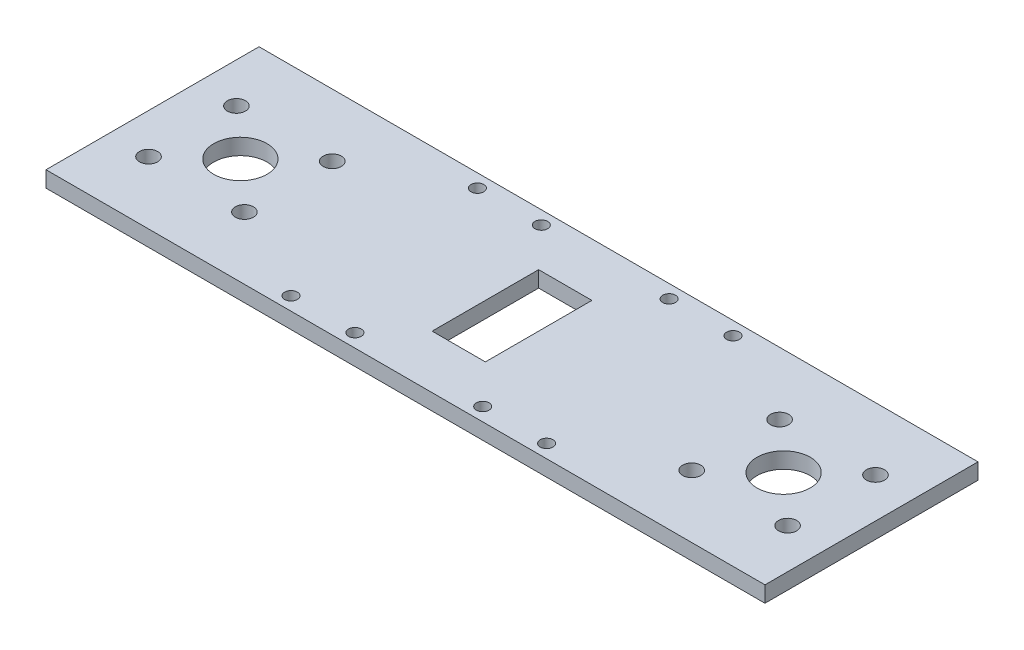
ISO-10303-21;
HEADER;
FILE_DESCRIPTION(('STEP AP214'),'2;1');
FILE_NAME('part.step','',(''),(''),'','','');
FILE_SCHEMA(('AUTOMOTIVE_DESIGN { 1 0 10303 214 1 1 1 1 }'));
ENDSEC;
DATA;
#1=APPLICATION_CONTEXT('core data for automotive mechanical design processes');
#2=APPLICATION_PROTOCOL_DEFINITION('international standard','automotive_design',2000,#1);
#3=PRODUCT_CONTEXT('',#1,'mechanical');
#4=PRODUCT('Part','Part','',(#3));
#5=PRODUCT_RELATED_PRODUCT_CATEGORY('part','',(#4));
#6=PRODUCT_DEFINITION_FORMATION('','',#4);
#7=PRODUCT_DEFINITION_CONTEXT('part definition',#1,'design');
#8=PRODUCT_DEFINITION('design','',#6,#7);
#9=PRODUCT_DEFINITION_SHAPE('','',#8);
#10=(LENGTH_UNIT() NAMED_UNIT(*) SI_UNIT(.MILLI.,.METRE.));
#11=(NAMED_UNIT(*) PLANE_ANGLE_UNIT() SI_UNIT($,.RADIAN.));
#12=(NAMED_UNIT(*) SI_UNIT($,.STERADIAN.) SOLID_ANGLE_UNIT());
#13=UNCERTAINTY_MEASURE_WITH_UNIT(LENGTH_MEASURE(1.E-05),#10,'distance_accuracy_value','');
#14=(GEOMETRIC_REPRESENTATION_CONTEXT(3) GLOBAL_UNCERTAINTY_ASSIGNED_CONTEXT((#13)) GLOBAL_UNIT_ASSIGNED_CONTEXT((#10,
#11,#12)) REPRESENTATION_CONTEXT('',''));
#15=CARTESIAN_POINT('',(0.,0.,0.));
#16=DIRECTION('',(0.,0.,1.));
#17=DIRECTION('',(1.,0.,0.));
#18=AXIS2_PLACEMENT_3D('',#15,#16,#17);
#19=CARTESIAN_POINT('',(0.,3.,0.));
#20=DIRECTION('',(0.,1.,0.));
#21=DIRECTION('',(0.,0.,1.));
#22=AXIS2_PLACEMENT_3D('',#19,#20,#21);
#23=PLANE('',#22);
#24=CARTESIAN_POINT('',(24.,3.,-17.5000000000001));
#25=DIRECTION('',(0.,1.,0.));
#26=DIRECTION('',(0.,0.,-1.));
#27=AXIS2_PLACEMENT_3D('',#24,#25,#26);
#28=CIRCLE('',#27,1.2);
#29=CARTESIAN_POINT('',(24.,3.,-18.7000000000001));
#30=VERTEX_POINT('',#29);
#31=EDGE_CURVE('E481',#30,#30,#28,.T.);
#32=ORIENTED_EDGE('',*,*,#31,.F.);
#33=EDGE_LOOP('',(#32));
#34=FACE_BOUND('',#33,.T.);
#35=CARTESIAN_POINT('',(12.,3.,17.5));
#36=DIRECTION('',(0.,1.,0.));
#37=DIRECTION('',(0.,0.,1.));
#38=AXIS2_PLACEMENT_3D('',#35,#36,#37);
#39=CIRCLE('',#38,1.2);
#40=CARTESIAN_POINT('',(12.,3.,18.7));
#41=VERTEX_POINT('',#40);
#42=EDGE_CURVE('E477',#41,#41,#39,.T.);
#43=ORIENTED_EDGE('',*,*,#42,.F.);
#44=EDGE_LOOP('',(#43));
#45=FACE_BOUND('',#44,.T.);
#46=CARTESIAN_POINT('',(12.,3.,-17.5));
#47=DIRECTION('',(0.,1.,0.));
#48=DIRECTION('',(0.,0.,-1.));
#49=AXIS2_PLACEMENT_3D('',#46,#47,#48);
#50=CIRCLE('',#49,1.2);
#51=CARTESIAN_POINT('',(12.,3.,-18.7));
#52=VERTEX_POINT('',#51);
#53=EDGE_CURVE('E482',#52,#52,#50,.T.);
#54=ORIENTED_EDGE('',*,*,#53,.F.);
#55=EDGE_LOOP('',(#54));
#56=FACE_BOUND('',#55,.T.);
#57=CARTESIAN_POINT('',(-24.,3.,17.4999999999999));
#58=DIRECTION('',(0.,1.,0.));
#59=DIRECTION('',(0.,0.,-1.));
#60=AXIS2_PLACEMENT_3D('',#57,#58,#59);
#61=CIRCLE('',#60,1.2);
#62=CARTESIAN_POINT('',(-24.,3.,16.2999999999999));
#63=VERTEX_POINT('',#62);
#64=EDGE_CURVE('E485',#63,#63,#61,.T.);
#65=ORIENTED_EDGE('',*,*,#64,.F.);
#66=EDGE_LOOP('',(#65));
#67=FACE_BOUND('',#66,.T.);
#68=CARTESIAN_POINT('',(-24.,3.,-17.5000000000001));
#69=DIRECTION('',(0.,1.,0.));
#70=DIRECTION('',(0.,0.,1.));
#71=AXIS2_PLACEMENT_3D('',#68,#69,#70);
#72=CIRCLE('',#71,1.2);
#73=CARTESIAN_POINT('',(-24.,3.,-16.3000000000001));
#74=VERTEX_POINT('',#73);
#75=EDGE_CURVE('E492',#74,#74,#72,.T.);
#76=ORIENTED_EDGE('',*,*,#75,.F.);
#77=EDGE_LOOP('',(#76));
#78=FACE_BOUND('',#77,.T.);
#79=CARTESIAN_POINT('',(-12.,3.,17.5));
#80=DIRECTION('',(0.,1.,0.));
#81=DIRECTION('',(0.,0.,-1.));
#82=AXIS2_PLACEMENT_3D('',#79,#80,#81);
#83=CIRCLE('',#82,1.2);
#84=CARTESIAN_POINT('',(-12.,3.,16.3));
#85=VERTEX_POINT('',#84);
#86=EDGE_CURVE('E474',#85,#85,#83,.T.);
#87=ORIENTED_EDGE('',*,*,#86,.F.);
#88=EDGE_LOOP('',(#87));
#89=FACE_BOUND('',#88,.T.);
#90=CARTESIAN_POINT('',(-12.,3.,-17.5));
#91=DIRECTION('',(0.,1.,0.));
#92=DIRECTION('',(0.,0.,1.));
#93=AXIS2_PLACEMENT_3D('',#90,#91,#92);
#94=CIRCLE('',#93,1.2);
#95=CARTESIAN_POINT('',(-12.,3.,-16.3));
#96=VERTEX_POINT('',#95);
#97=EDGE_CURVE('E471',#96,#96,#94,.T.);
#98=ORIENTED_EDGE('',*,*,#97,.F.);
#99=EDGE_LOOP('',(#98));
#100=FACE_BOUND('',#99,.T.);
#101=CARTESIAN_POINT('',(24.,3.,17.4999999999999));
#102=DIRECTION('',(0.,1.,0.));
#103=DIRECTION('',(0.,0.,1.));
#104=AXIS2_PLACEMENT_3D('',#101,#102,#103);
#105=CIRCLE('',#104,1.2);
#106=CARTESIAN_POINT('',(24.,3.,18.6999999999999));
#107=VERTEX_POINT('',#106);
#108=EDGE_CURVE('E283',#107,#107,#105,.T.);
#109=ORIENTED_EDGE('',*,*,#108,.F.);
#110=EDGE_LOOP('',(#109));
#111=FACE_BOUND('',#110,.T.);
#112=CARTESIAN_POINT('',(59.9999999999999,3.,8.25000000000005));
#113=DIRECTION('',(0.,1.,0.));
#114=DIRECTION('',(0.,0.,-1.));
#115=AXIS2_PLACEMENT_3D('',#112,#113,#114);
#116=CIRCLE('',#115,1.70000000000108);
#117=CARTESIAN_POINT('',(59.9999999999999,3.,6.54999999999897));
#118=VERTEX_POINT('',#117);
#119=EDGE_CURVE('E170',#118,#118,#116,.T.);
#120=ORIENTED_EDGE('',*,*,#119,.F.);
#121=EDGE_LOOP('',(#120));
#122=FACE_BOUND('',#121,.T.);
#123=CARTESIAN_POINT('',(42.0000000000001,3.,-8.24999999999994));
#124=DIRECTION('',(0.,1.,0.));
#125=DIRECTION('',(0.,0.,-1.));
#126=AXIS2_PLACEMENT_3D('',#123,#124,#125);
#127=CIRCLE('',#126,1.70000000000108);
#128=CARTESIAN_POINT('',(42.0000000000001,3.,-9.95000000000103));
#129=VERTEX_POINT('',#128);
#130=EDGE_CURVE('E186',#129,#129,#127,.T.);
#131=ORIENTED_EDGE('',*,*,#130,.F.);
#132=EDGE_LOOP('',(#131));
#133=FACE_BOUND('',#132,.T.);
#134=CARTESIAN_POINT('',(-41.9999999999999,3.,8.25000000000007));
#135=DIRECTION('',(0.,1.,0.));
#136=DIRECTION('',(0.,0.,1.));
#137=AXIS2_PLACEMENT_3D('',#134,#135,#136);
#138=CIRCLE('',#137,1.70000000000108);
#139=CARTESIAN_POINT('',(-41.9999999999999,3.,9.95000000000115));
#140=VERTEX_POINT('',#139);
#141=EDGE_CURVE('E202',#140,#140,#138,.T.);
#142=ORIENTED_EDGE('',*,*,#141,.F.);
#143=EDGE_LOOP('',(#142));
#144=FACE_BOUND('',#143,.T.);
#145=CARTESIAN_POINT('',(51.0000000000001,3.,0.));
#146=DIRECTION('',(0.,1.,0.));
#147=DIRECTION('',(0.,0.,-1.));
#148=AXIS2_PLACEMENT_3D('',#145,#146,#147);
#149=CIRCLE('',#148,5.);
#150=CARTESIAN_POINT('',(51.0000000000001,3.,-4.99999999999994));
#151=VERTEX_POINT('',#150);
#152=EDGE_CURVE('E218',#151,#151,#149,.T.);
#153=ORIENTED_EDGE('',*,*,#152,.F.);
#154=EDGE_LOOP('',(#153));
#155=FACE_BOUND('',#154,.T.);
#156=CARTESIAN_POINT('',(-51.0000000000001,3.,0.));
#157=DIRECTION('',(0.,1.,0.));
#158=DIRECTION('',(0.,0.,1.));
#159=AXIS2_PLACEMENT_3D('',#156,#157,#158);
#160=CIRCLE('',#159,5.);
#161=CARTESIAN_POINT('',(-51.0000000000001,3.,5.00000000000006));
#162=VERTEX_POINT('',#161);
#163=EDGE_CURVE('E234',#162,#162,#160,.T.);
#164=ORIENTED_EDGE('',*,*,#163,.F.);
#165=EDGE_LOOP('',(#164));
#166=FACE_BOUND('',#165,.T.);
#167=DIRECTION('',(0.,0.,-1.));
#168=VECTOR('',#167,1.);
#169=CARTESIAN_POINT('',(67.4999999999999,3.,-19.9999999999999));
#170=LINE('',#169,#168);
#171=CARTESIAN_POINT('',(67.4999999999999,3.,20.0000000000001));
#172=VERTEX_POINT('',#171);
#173=CARTESIAN_POINT('',(67.4999999999999,3.,-19.9999999999999));
#174=VERTEX_POINT('',#173);
#175=EDGE_CURVE('E242',#172,#174,#170,.T.);
#176=ORIENTED_EDGE('',*,*,#175,.T.);
#177=DIRECTION('',(-1.,0.,0.));
#178=VECTOR('',#177,1.);
#179=CARTESIAN_POINT('',(-67.5000000000001,3.,-19.9999999999999));
#180=LINE('',#179,#178);
#181=CARTESIAN_POINT('',(-67.5000000000001,3.,-19.9999999999999));
#182=VERTEX_POINT('',#181);
#183=EDGE_CURVE('E246',#174,#182,#180,.T.);
#184=ORIENTED_EDGE('',*,*,#183,.T.);
#185=DIRECTION('',(0.,0.,1.));
#186=VECTOR('',#185,1.);
#187=CARTESIAN_POINT('',(-67.5000000000001,3.,-19.9999999999999));
#188=LINE('',#187,#186);
#189=CARTESIAN_POINT('',(-67.5000000000001,3.,20.));
#190=VERTEX_POINT('',#189);
#191=EDGE_CURVE('E250',#182,#190,#188,.T.);
#192=ORIENTED_EDGE('',*,*,#191,.T.);
#193=DIRECTION('',(1.,0.,0.));
#194=VECTOR('',#193,1.);
#195=CARTESIAN_POINT('',(-67.5000000000001,3.,20.));
#196=LINE('',#195,#194);
#197=EDGE_CURVE('E253',#190,#172,#196,.T.);
#198=ORIENTED_EDGE('',*,*,#197,.T.);
#199=EDGE_LOOP('',(#176,#184,#192,#198));
#200=FACE_BOUND('',#199,.T.);
#201=CARTESIAN_POINT('',(-60.0000000000001,3.,-8.24999999999993));
#202=DIRECTION('',(0.,1.,0.));
#203=DIRECTION('',(0.,0.,1.));
#204=AXIS2_PLACEMENT_3D('',#201,#202,#203);
#205=CIRCLE('',#204,1.70000000000108);
#206=CARTESIAN_POINT('',(-60.0000000000001,3.,-6.54999999999885));
#207=VERTEX_POINT('',#206);
#208=EDGE_CURVE('E226',#207,#207,#205,.T.);
#209=ORIENTED_EDGE('',*,*,#208,.F.);
#210=EDGE_LOOP('',(#209));
#211=FACE_BOUND('',#210,.T.);
#212=CARTESIAN_POINT('',(-42.0000000000001,3.,-8.24999999999993));
#213=DIRECTION('',(0.,1.,0.));
#214=DIRECTION('',(0.,0.,1.));
#215=AXIS2_PLACEMENT_3D('',#212,#213,#214);
#216=CIRCLE('',#215,1.70000000000108);
#217=CARTESIAN_POINT('',(-42.0000000000001,3.,-6.54999999999885));
#218=VERTEX_POINT('',#217);
#219=EDGE_CURVE('E210',#218,#218,#216,.T.);
#220=ORIENTED_EDGE('',*,*,#219,.F.);
#221=EDGE_LOOP('',(#220));
#222=FACE_BOUND('',#221,.T.);
#223=CARTESIAN_POINT('',(-59.9999999999999,3.,8.25000000000006));
#224=DIRECTION('',(0.,1.,0.));
#225=DIRECTION('',(0.,0.,1.));
#226=AXIS2_PLACEMENT_3D('',#223,#224,#225);
#227=CIRCLE('',#226,1.70000000000108);
#228=CARTESIAN_POINT('',(-59.9999999999999,3.,9.95000000000115));
#229=VERTEX_POINT('',#228);
#230=EDGE_CURVE('E194',#229,#229,#227,.T.);
#231=ORIENTED_EDGE('',*,*,#230,.F.);
#232=EDGE_LOOP('',(#231));
#233=FACE_BOUND('',#232,.T.);
#234=CARTESIAN_POINT('',(41.9999999999999,3.,8.25000000000006));
#235=DIRECTION('',(0.,1.,0.));
#236=DIRECTION('',(0.,0.,-1.));
#237=AXIS2_PLACEMENT_3D('',#234,#235,#236);
#238=CIRCLE('',#237,1.70000000000108);
#239=CARTESIAN_POINT('',(41.9999999999999,3.,6.54999999999897));
#240=VERTEX_POINT('',#239);
#241=EDGE_CURVE('E178',#240,#240,#238,.T.);
#242=ORIENTED_EDGE('',*,*,#241,.F.);
#243=EDGE_LOOP('',(#242));
#244=FACE_BOUND('',#243,.T.);
#245=CARTESIAN_POINT('',(60.0000000000001,3.,-8.24999999999995));
#246=DIRECTION('',(0.,1.,0.));
#247=DIRECTION('',(0.,0.,-1.));
#248=AXIS2_PLACEMENT_3D('',#245,#246,#247);
#249=CIRCLE('',#248,1.70000000000108);
#250=CARTESIAN_POINT('',(60.0000000000001,3.,-9.95000000000103));
#251=VERTEX_POINT('',#250);
#252=EDGE_CURVE('E162',#251,#251,#249,.T.);
#253=ORIENTED_EDGE('',*,*,#252,.F.);
#254=EDGE_LOOP('',(#253));
#255=FACE_BOUND('',#254,.T.);
#256=DIRECTION('',(-1.,0.,0.));
#257=VECTOR('',#256,1.);
#258=CARTESIAN_POINT('',(-5.00000000000005,3.,-9.99999999999997));
#259=LINE('',#258,#257);
#260=CARTESIAN_POINT('',(4.99999999999995,3.,-9.99999999999997));
#261=VERTEX_POINT('',#260);
#262=CARTESIAN_POINT('',(-5.00000000000005,3.,-9.99999999999997));
#263=VERTEX_POINT('',#262);
#264=EDGE_CURVE('E122',#261,#263,#259,.T.);
#265=ORIENTED_EDGE('',*,*,#264,.F.);
#266=DIRECTION('',(0.,0.,-1.));
#267=VECTOR('',#266,1.);
#268=CARTESIAN_POINT('',(4.99999999999995,3.,-9.99999999999997));
#269=LINE('',#268,#267);
#270=CARTESIAN_POINT('',(4.99999999999995,3.,10.));
#271=VERTEX_POINT('',#270);
#272=EDGE_CURVE('E113',#271,#261,#269,.T.);
#273=ORIENTED_EDGE('',*,*,#272,.F.);
#274=DIRECTION('',(1.,0.,0.));
#275=VECTOR('',#274,1.);
#276=CARTESIAN_POINT('',(-5.00000000000005,3.,10.));
#277=LINE('',#276,#275);
#278=CARTESIAN_POINT('',(-5.00000000000005,3.,10.));
#279=VERTEX_POINT('',#278);
#280=EDGE_CURVE('E139',#279,#271,#277,.T.);
#281=ORIENTED_EDGE('',*,*,#280,.F.);
#282=DIRECTION('',(0.,0.,1.));
#283=VECTOR('',#282,1.);
#284=CARTESIAN_POINT('',(-5.00000000000005,3.,-9.99999999999997));
#285=LINE('',#284,#283);
#286=EDGE_CURVE('E135',#263,#279,#285,.T.);
#287=ORIENTED_EDGE('',*,*,#286,.F.);
#288=EDGE_LOOP('',(#265,#273,#281,#287));
#289=FACE_BOUND('',#288,.T.);
#290=ADVANCED_FACE('F45',(#34,#45,#56,#67,#78,#89,#100,#111,#122,#133,#144,#155,#166,#200,#211,
#222,#233,#244,#255,#289),#23,.T.);
#291=CARTESIAN_POINT('',(0.,0.,0.));
#292=DIRECTION('',(0.,1.,0.));
#293=DIRECTION('',(0.,0.,1.));
#294=AXIS2_PLACEMENT_3D('',#291,#292,#293);
#295=PLANE('',#294);
#296=CARTESIAN_POINT('',(24.,0.,-17.5000000000001));
#297=DIRECTION('',(0.,1.,0.));
#298=DIRECTION('',(0.,0.,1.));
#299=AXIS2_PLACEMENT_3D('',#296,#297,#298);
#300=CIRCLE('',#299,1.2);
#301=CARTESIAN_POINT('',(24.,0.,-16.3000000000001));
#302=VERTEX_POINT('',#301);
#303=EDGE_CURVE('E49',#302,#302,#300,.T.);
#304=ORIENTED_EDGE('',*,*,#303,.T.);
#305=EDGE_LOOP('',(#304));
#306=FACE_BOUND('',#305,.T.);
#307=CARTESIAN_POINT('',(12.,0.,17.5));
#308=DIRECTION('',(0.,1.,0.));
#309=DIRECTION('',(0.,0.,1.));
#310=AXIS2_PLACEMENT_3D('',#307,#308,#309);
#311=CIRCLE('',#310,1.2);
#312=CARTESIAN_POINT('',(12.,0.,18.7));
#313=VERTEX_POINT('',#312);
#314=EDGE_CURVE('E302',#313,#313,#311,.T.);
#315=ORIENTED_EDGE('',*,*,#314,.T.);
#316=EDGE_LOOP('',(#315));
#317=FACE_BOUND('',#316,.T.);
#318=CARTESIAN_POINT('',(12.,0.,-17.5));
#319=DIRECTION('',(0.,1.,0.));
#320=DIRECTION('',(0.,0.,1.));
#321=AXIS2_PLACEMENT_3D('',#318,#319,#320);
#322=CIRCLE('',#321,1.2);
#323=CARTESIAN_POINT('',(12.,0.,-16.3));
#324=VERTEX_POINT('',#323);
#325=EDGE_CURVE('E299',#324,#324,#322,.T.);
#326=ORIENTED_EDGE('',*,*,#325,.T.);
#327=EDGE_LOOP('',(#326));
#328=FACE_BOUND('',#327,.T.);
#329=CARTESIAN_POINT('',(-24.,0.,17.4999999999999));
#330=DIRECTION('',(0.,1.,0.));
#331=DIRECTION('',(0.,0.,1.));
#332=AXIS2_PLACEMENT_3D('',#329,#330,#331);
#333=CIRCLE('',#332,1.2);
#334=CARTESIAN_POINT('',(-24.,0.,18.6999999999999));
#335=VERTEX_POINT('',#334);
#336=EDGE_CURVE('E295',#335,#335,#333,.T.);
#337=ORIENTED_EDGE('',*,*,#336,.T.);
#338=EDGE_LOOP('',(#337));
#339=FACE_BOUND('',#338,.T.);
#340=CARTESIAN_POINT('',(-24.,0.,-17.5000000000001));
#341=DIRECTION('',(0.,1.,0.));
#342=DIRECTION('',(0.,0.,1.));
#343=AXIS2_PLACEMENT_3D('',#340,#341,#342);
#344=CIRCLE('',#343,1.2);
#345=CARTESIAN_POINT('',(-24.,0.,-16.3000000000001));
#346=VERTEX_POINT('',#345);
#347=EDGE_CURVE('E291',#346,#346,#344,.T.);
#348=ORIENTED_EDGE('',*,*,#347,.T.);
#349=EDGE_LOOP('',(#348));
#350=FACE_BOUND('',#349,.T.);
#351=CARTESIAN_POINT('',(-12.,0.,17.5));
#352=DIRECTION('',(0.,1.,0.));
#353=DIRECTION('',(0.,0.,1.));
#354=AXIS2_PLACEMENT_3D('',#351,#352,#353);
#355=CIRCLE('',#354,1.2);
#356=CARTESIAN_POINT('',(-12.,0.,18.7));
#357=VERTEX_POINT('',#356);
#358=EDGE_CURVE('E287',#357,#357,#355,.T.);
#359=ORIENTED_EDGE('',*,*,#358,.T.);
#360=EDGE_LOOP('',(#359));
#361=FACE_BOUND('',#360,.T.);
#362=CARTESIAN_POINT('',(-12.,0.,-17.5));
#363=DIRECTION('',(0.,1.,0.));
#364=DIRECTION('',(0.,0.,1.));
#365=AXIS2_PLACEMENT_3D('',#362,#363,#364);
#366=CIRCLE('',#365,1.2);
#367=CARTESIAN_POINT('',(-12.,0.,-16.3));
#368=VERTEX_POINT('',#367);
#369=EDGE_CURVE('E282',#368,#368,#366,.T.);
#370=ORIENTED_EDGE('',*,*,#369,.T.);
#371=EDGE_LOOP('',(#370));
#372=FACE_BOUND('',#371,.T.);
#373=CARTESIAN_POINT('',(24.,0.,17.4999999999999));
#374=DIRECTION('',(0.,1.,0.));
#375=DIRECTION('',(0.,0.,1.));
#376=AXIS2_PLACEMENT_3D('',#373,#374,#375);
#377=CIRCLE('',#376,1.2);
#378=CARTESIAN_POINT('',(24.,0.,18.6999999999999));
#379=VERTEX_POINT('',#378);
#380=EDGE_CURVE('E278',#379,#379,#377,.T.);
#381=ORIENTED_EDGE('',*,*,#380,.T.);
#382=EDGE_LOOP('',(#381));
#383=FACE_BOUND('',#382,.T.);
#384=CARTESIAN_POINT('',(60.0000000000001,0.,-8.24999999999995));
#385=DIRECTION('',(0.,1.,0.));
#386=DIRECTION('',(0.,0.,-1.));
#387=AXIS2_PLACEMENT_3D('',#384,#385,#386);
#388=CIRCLE('',#387,1.70000000000108);
#389=CARTESIAN_POINT('',(60.0000000000001,0.,-9.95000000000103));
#390=VERTEX_POINT('',#389);
#391=EDGE_CURVE('E131',#390,#390,#388,.T.);
#392=ORIENTED_EDGE('',*,*,#391,.T.);
#393=EDGE_LOOP('',(#392));
#394=FACE_BOUND('',#393,.T.);
#395=CARTESIAN_POINT('',(59.9999999999999,0.,8.25000000000005));
#396=DIRECTION('',(0.,1.,0.));
#397=DIRECTION('',(0.,0.,-1.));
#398=AXIS2_PLACEMENT_3D('',#395,#396,#397);
#399=CIRCLE('',#398,1.70000000000108);
#400=CARTESIAN_POINT('',(59.9999999999999,0.,6.54999999999897));
#401=VERTEX_POINT('',#400);
#402=EDGE_CURVE('E166',#401,#401,#399,.T.);
#403=ORIENTED_EDGE('',*,*,#402,.T.);
#404=EDGE_LOOP('',(#403));
#405=FACE_BOUND('',#404,.T.);
#406=CARTESIAN_POINT('',(41.9999999999999,0.,8.25000000000006));
#407=DIRECTION('',(0.,1.,0.));
#408=DIRECTION('',(0.,0.,-1.));
#409=AXIS2_PLACEMENT_3D('',#406,#407,#408);
#410=CIRCLE('',#409,1.70000000000108);
#411=CARTESIAN_POINT('',(41.9999999999999,0.,6.54999999999897));
#412=VERTEX_POINT('',#411);
#413=EDGE_CURVE('E174',#412,#412,#410,.T.);
#414=ORIENTED_EDGE('',*,*,#413,.T.);
#415=EDGE_LOOP('',(#414));
#416=FACE_BOUND('',#415,.T.);
#417=CARTESIAN_POINT('',(42.0000000000001,0.,-8.24999999999994));
#418=DIRECTION('',(0.,1.,0.));
#419=DIRECTION('',(0.,0.,-1.));
#420=AXIS2_PLACEMENT_3D('',#417,#418,#419);
#421=CIRCLE('',#420,1.70000000000108);
#422=CARTESIAN_POINT('',(42.0000000000001,0.,-9.95000000000103));
#423=VERTEX_POINT('',#422);
#424=EDGE_CURVE('E182',#423,#423,#421,.T.);
#425=ORIENTED_EDGE('',*,*,#424,.T.);
#426=EDGE_LOOP('',(#425));
#427=FACE_BOUND('',#426,.T.);
#428=CARTESIAN_POINT('',(-59.9999999999999,0.,8.25000000000006));
#429=DIRECTION('',(0.,1.,0.));
#430=DIRECTION('',(0.,0.,1.));
#431=AXIS2_PLACEMENT_3D('',#428,#429,#430);
#432=CIRCLE('',#431,1.70000000000108);
#433=CARTESIAN_POINT('',(-59.9999999999999,0.,9.95000000000115));
#434=VERTEX_POINT('',#433);
#435=EDGE_CURVE('E190',#434,#434,#432,.T.);
#436=ORIENTED_EDGE('',*,*,#435,.T.);
#437=EDGE_LOOP('',(#436));
#438=FACE_BOUND('',#437,.T.);
#439=CARTESIAN_POINT('',(-41.9999999999999,0.,8.25000000000007));
#440=DIRECTION('',(0.,1.,0.));
#441=DIRECTION('',(0.,0.,1.));
#442=AXIS2_PLACEMENT_3D('',#439,#440,#441);
#443=CIRCLE('',#442,1.70000000000108);
#444=CARTESIAN_POINT('',(-41.9999999999999,0.,9.95000000000115));
#445=VERTEX_POINT('',#444);
#446=EDGE_CURVE('E198',#445,#445,#443,.T.);
#447=ORIENTED_EDGE('',*,*,#446,.T.);
#448=EDGE_LOOP('',(#447));
#449=FACE_BOUND('',#448,.T.);
#450=CARTESIAN_POINT('',(-42.0000000000001,0.,-8.24999999999993));
#451=DIRECTION('',(0.,1.,0.));
#452=DIRECTION('',(0.,0.,1.));
#453=AXIS2_PLACEMENT_3D('',#450,#451,#452);
#454=CIRCLE('',#453,1.70000000000108);
#455=CARTESIAN_POINT('',(-42.0000000000001,0.,-6.54999999999885));
#456=VERTEX_POINT('',#455);
#457=EDGE_CURVE('E206',#456,#456,#454,.T.);
#458=ORIENTED_EDGE('',*,*,#457,.T.);
#459=EDGE_LOOP('',(#458));
#460=FACE_BOUND('',#459,.T.);
#461=CARTESIAN_POINT('',(51.0000000000001,0.,0.));
#462=DIRECTION('',(0.,1.,0.));
#463=DIRECTION('',(0.,0.,-1.));
#464=AXIS2_PLACEMENT_3D('',#461,#462,#463);
#465=CIRCLE('',#464,5.);
#466=CARTESIAN_POINT('',(51.0000000000001,0.,-4.99999999999994));
#467=VERTEX_POINT('',#466);
#468=EDGE_CURVE('E214',#467,#467,#465,.T.);
#469=ORIENTED_EDGE('',*,*,#468,.T.);
#470=EDGE_LOOP('',(#469));
#471=FACE_BOUND('',#470,.T.);
#472=CARTESIAN_POINT('',(-60.0000000000001,0.,-8.24999999999993));
#473=DIRECTION('',(0.,1.,0.));
#474=DIRECTION('',(0.,0.,1.));
#475=AXIS2_PLACEMENT_3D('',#472,#473,#474);
#476=CIRCLE('',#475,1.70000000000108);
#477=CARTESIAN_POINT('',(-60.0000000000001,0.,-6.54999999999885));
#478=VERTEX_POINT('',#477);
#479=EDGE_CURVE('E222',#478,#478,#476,.T.);
#480=ORIENTED_EDGE('',*,*,#479,.T.);
#481=EDGE_LOOP('',(#480));
#482=FACE_BOUND('',#481,.T.);
#483=CARTESIAN_POINT('',(-51.0000000000001,0.,0.));
#484=DIRECTION('',(0.,1.,0.));
#485=DIRECTION('',(0.,0.,1.));
#486=AXIS2_PLACEMENT_3D('',#483,#484,#485);
#487=CIRCLE('',#486,5.);
#488=CARTESIAN_POINT('',(-51.0000000000001,0.,5.00000000000006));
#489=VERTEX_POINT('',#488);
#490=EDGE_CURVE('E230',#489,#489,#487,.T.);
#491=ORIENTED_EDGE('',*,*,#490,.T.);
#492=EDGE_LOOP('',(#491));
#493=FACE_BOUND('',#492,.T.);
#494=DIRECTION('',(0.,0.,-1.));
#495=VECTOR('',#494,1.);
#496=CARTESIAN_POINT('',(67.4999999999999,0.,-19.9999999999999));
#497=LINE('',#496,#495);
#498=CARTESIAN_POINT('',(67.4999999999999,0.,20.0000000000001));
#499=VERTEX_POINT('',#498);
#500=CARTESIAN_POINT('',(67.4999999999999,0.,-19.9999999999999));
#501=VERTEX_POINT('',#500);
#502=EDGE_CURVE('E238',#499,#501,#497,.T.);
#503=ORIENTED_EDGE('',*,*,#502,.F.);
#504=DIRECTION('',(1.,0.,0.));
#505=VECTOR('',#504,1.);
#506=CARTESIAN_POINT('',(-67.5000000000001,0.,20.));
#507=LINE('',#506,#505);
#508=CARTESIAN_POINT('',(-67.5000000000001,0.,20.));
#509=VERTEX_POINT('',#508);
#510=EDGE_CURVE('E247',#509,#499,#507,.T.);
#511=ORIENTED_EDGE('',*,*,#510,.F.);
#512=DIRECTION('',(0.,0.,1.));
#513=VECTOR('',#512,1.);
#514=CARTESIAN_POINT('',(-67.5000000000001,0.,-19.9999999999999));
#515=LINE('',#514,#513);
#516=CARTESIAN_POINT('',(-67.5000000000001,0.,-19.9999999999999));
#517=VERTEX_POINT('',#516);
#518=EDGE_CURVE('E263',#517,#509,#515,.T.);
#519=ORIENTED_EDGE('',*,*,#518,.F.);
#520=DIRECTION('',(-1.,0.,0.));
#521=VECTOR('',#520,1.);
#522=CARTESIAN_POINT('',(-67.5000000000001,0.,-19.9999999999999));
#523=LINE('',#522,#521);
#524=EDGE_CURVE('E260',#501,#517,#523,.T.);
#525=ORIENTED_EDGE('',*,*,#524,.F.);
#526=EDGE_LOOP('',(#503,#511,#519,#525));
#527=FACE_BOUND('',#526,.T.);
#528=DIRECTION('',(0.,0.,-1.));
#529=VECTOR('',#528,1.);
#530=CARTESIAN_POINT('',(4.99999999999995,0.,-9.99999999999997));
#531=LINE('',#530,#529);
#532=CARTESIAN_POINT('',(4.99999999999995,0.,10.));
#533=VERTEX_POINT('',#532);
#534=CARTESIAN_POINT('',(4.99999999999995,0.,-9.99999999999997));
#535=VERTEX_POINT('',#534);
#536=EDGE_CURVE('E71',#533,#535,#531,.T.);
#537=ORIENTED_EDGE('',*,*,#536,.T.);
#538=DIRECTION('',(-1.,0.,0.));
#539=VECTOR('',#538,1.);
#540=CARTESIAN_POINT('',(-5.00000000000005,0.,-9.99999999999997));
#541=LINE('',#540,#539);
#542=CARTESIAN_POINT('',(-5.00000000000005,0.,-9.99999999999997));
#543=VERTEX_POINT('',#542);
#544=EDGE_CURVE('E129',#535,#543,#541,.T.);
#545=ORIENTED_EDGE('',*,*,#544,.T.);
#546=DIRECTION('',(0.,0.,1.));
#547=VECTOR('',#546,1.);
#548=CARTESIAN_POINT('',(-5.00000000000005,0.,-9.99999999999997));
#549=LINE('',#548,#547);
#550=CARTESIAN_POINT('',(-5.00000000000005,0.,10.));
#551=VERTEX_POINT('',#550);
#552=EDGE_CURVE('E149',#543,#551,#549,.T.);
#553=ORIENTED_EDGE('',*,*,#552,.T.);
#554=DIRECTION('',(1.,0.,0.));
#555=VECTOR('',#554,1.);
#556=CARTESIAN_POINT('',(-5.00000000000005,0.,10.));
#557=LINE('',#556,#555);
#558=EDGE_CURVE('E123',#551,#533,#557,.T.);
#559=ORIENTED_EDGE('',*,*,#558,.T.);
#560=EDGE_LOOP('',(#537,#545,#553,#559));
#561=FACE_BOUND('',#560,.T.);
#562=ADVANCED_FACE('F311',(#306,#317,#328,#339,#350,#361,#372,#383,#394,#405,#416,#427,#438,
#449,#460,#471,#482,#493,#527,#561),#295,.F.);
#563=CARTESIAN_POINT('',(67.4999999999999,3.,-19.9999999999999));
#564=DIRECTION('',(-1.,0.,0.));
#565=DIRECTION('',(0.,0.,1.));
#566=AXIS2_PLACEMENT_3D('',#563,#564,#565);
#567=PLANE('',#566);
#568=ORIENTED_EDGE('',*,*,#502,.T.);
#569=DIRECTION('',(0.,-1.,0.));
#570=VECTOR('',#569,1.);
#571=CARTESIAN_POINT('',(67.4999999999999,3.,-19.9999999999999));
#572=LINE('',#571,#570);
#573=EDGE_CURVE('E11',#174,#501,#572,.T.);
#574=ORIENTED_EDGE('',*,*,#573,.F.);
#575=ORIENTED_EDGE('',*,*,#175,.F.);
#576=DIRECTION('',(0.,-1.,0.));
#577=VECTOR('',#576,1.);
#578=CARTESIAN_POINT('',(67.4999999999999,3.,20.0000000000001));
#579=LINE('',#578,#577);
#580=EDGE_CURVE('E256',#172,#499,#579,.T.);
#581=ORIENTED_EDGE('',*,*,#580,.T.);
#582=EDGE_LOOP('',(#568,#574,#575,#581));
#583=FACE_BOUND('',#582,.T.);
#584=ADVANCED_FACE('F47',(#583),#567,.F.);
#585=CARTESIAN_POINT('',(-67.5000000000001,3.,-19.9999999999999));
#586=DIRECTION('',(0.,0.,1.));
#587=DIRECTION('',(1.,0.,0.));
#588=AXIS2_PLACEMENT_3D('',#585,#586,#587);
#589=PLANE('',#588);
#590=ORIENTED_EDGE('',*,*,#524,.T.);
#591=DIRECTION('',(0.,-1.,0.));
#592=VECTOR('',#591,1.);
#593=CARTESIAN_POINT('',(-67.5000000000001,3.,-19.9999999999999));
#594=LINE('',#593,#592);
#595=EDGE_CURVE('E55',#182,#517,#594,.T.);
#596=ORIENTED_EDGE('',*,*,#595,.F.);
#597=ORIENTED_EDGE('',*,*,#183,.F.);
#598=ORIENTED_EDGE('',*,*,#573,.T.);
#599=EDGE_LOOP('',(#590,#596,#597,#598));
#600=FACE_BOUND('',#599,.T.);
#601=ADVANCED_FACE('F346',(#600),#589,.F.);
#602=CARTESIAN_POINT('',(-67.5000000000001,3.,-19.9999999999999));
#603=DIRECTION('',(1.,0.,0.));
#604=DIRECTION('',(0.,0.,-1.));
#605=AXIS2_PLACEMENT_3D('',#602,#603,#604);
#606=PLANE('',#605);
#607=ORIENTED_EDGE('',*,*,#518,.T.);
#608=DIRECTION('',(0.,-1.,0.));
#609=VECTOR('',#608,1.);
#610=CARTESIAN_POINT('',(-67.5000000000001,3.,20.));
#611=LINE('',#610,#609);
#612=EDGE_CURVE('E271',#190,#509,#611,.T.);
#613=ORIENTED_EDGE('',*,*,#612,.F.);
#614=ORIENTED_EDGE('',*,*,#191,.F.);
#615=ORIENTED_EDGE('',*,*,#595,.T.);
#616=EDGE_LOOP('',(#607,#613,#614,#615));
#617=FACE_BOUND('',#616,.T.);
#618=ADVANCED_FACE('F343',(#617),#606,.F.);
#619=CARTESIAN_POINT('',(-67.5000000000001,3.,20.));
#620=DIRECTION('',(0.,0.,-1.));
#621=DIRECTION('',(-1.,0.,0.));
#622=AXIS2_PLACEMENT_3D('',#619,#620,#621);
#623=PLANE('',#622);
#624=ORIENTED_EDGE('',*,*,#510,.T.);
#625=ORIENTED_EDGE('',*,*,#580,.F.);
#626=ORIENTED_EDGE('',*,*,#197,.F.);
#627=ORIENTED_EDGE('',*,*,#612,.T.);
#628=EDGE_LOOP('',(#624,#625,#626,#627));
#629=FACE_BOUND('',#628,.T.);
#630=ADVANCED_FACE('F340',(#629),#623,.F.);
#631=CARTESIAN_POINT('',(-51.0000000000001,3.,0.));
#632=DIRECTION('',(0.,-1.,0.));
#633=DIRECTION('',(0.,0.,-1.));
#634=AXIS2_PLACEMENT_3D('',#631,#632,#633);
#635=CYLINDRICAL_SURFACE('',#634,5.);
#636=ORIENTED_EDGE('',*,*,#163,.T.);
#637=EDGE_LOOP('',(#636));
#638=FACE_BOUND('',#637,.T.);
#639=ORIENTED_EDGE('',*,*,#490,.F.);
#640=EDGE_LOOP('',(#639));
#641=FACE_BOUND('',#640,.T.);
#642=ADVANCED_FACE('F337',(#638,#641),#635,.F.);
#643=CARTESIAN_POINT('',(-60.0000000000001,3.,-8.24999999999993));
#644=DIRECTION('',(0.,-1.,0.));
#645=DIRECTION('',(0.,0.,-1.));
#646=AXIS2_PLACEMENT_3D('',#643,#644,#645);
#647=CYLINDRICAL_SURFACE('',#646,1.70000000000108);
#648=ORIENTED_EDGE('',*,*,#208,.T.);
#649=EDGE_LOOP('',(#648));
#650=FACE_BOUND('',#649,.T.);
#651=ORIENTED_EDGE('',*,*,#479,.F.);
#652=EDGE_LOOP('',(#651));
#653=FACE_BOUND('',#652,.T.);
#654=ADVANCED_FACE('F405',(#650,#653),#647,.F.);
#655=CARTESIAN_POINT('',(51.0000000000001,3.,0.));
#656=DIRECTION('',(0.,-1.,0.));
#657=DIRECTION('',(0.,0.,-1.));
#658=AXIS2_PLACEMENT_3D('',#655,#656,#657);
#659=CYLINDRICAL_SURFACE('',#658,5.);
#660=ORIENTED_EDGE('',*,*,#152,.T.);
#661=EDGE_LOOP('',(#660));
#662=FACE_BOUND('',#661,.T.);
#663=ORIENTED_EDGE('',*,*,#468,.F.);
#664=EDGE_LOOP('',(#663));
#665=FACE_BOUND('',#664,.T.);
#666=ADVANCED_FACE('F410',(#662,#665),#659,.F.);
#667=CARTESIAN_POINT('',(-42.0000000000001,3.,-8.24999999999993));
#668=DIRECTION('',(0.,-1.,0.));
#669=DIRECTION('',(0.,0.,-1.));
#670=AXIS2_PLACEMENT_3D('',#667,#668,#669);
#671=CYLINDRICAL_SURFACE('',#670,1.70000000000108);
#672=ORIENTED_EDGE('',*,*,#219,.T.);
#673=EDGE_LOOP('',(#672));
#674=FACE_BOUND('',#673,.T.);
#675=ORIENTED_EDGE('',*,*,#457,.F.);
#676=EDGE_LOOP('',(#675));
#677=FACE_BOUND('',#676,.T.);
#678=ADVANCED_FACE('F417',(#674,#677),#671,.F.);
#679=CARTESIAN_POINT('',(-41.9999999999999,3.,8.25000000000007));
#680=DIRECTION('',(0.,-1.,0.));
#681=DIRECTION('',(0.,0.,-1.));
#682=AXIS2_PLACEMENT_3D('',#679,#680,#681);
#683=CYLINDRICAL_SURFACE('',#682,1.70000000000108);
#684=ORIENTED_EDGE('',*,*,#141,.T.);
#685=EDGE_LOOP('',(#684));
#686=FACE_BOUND('',#685,.T.);
#687=ORIENTED_EDGE('',*,*,#446,.F.);
#688=EDGE_LOOP('',(#687));
#689=FACE_BOUND('',#688,.T.);
#690=ADVANCED_FACE('F424',(#686,#689),#683,.F.);
#691=CARTESIAN_POINT('',(-59.9999999999999,3.,8.25000000000006));
#692=DIRECTION('',(0.,-1.,0.));
#693=DIRECTION('',(0.,0.,-1.));
#694=AXIS2_PLACEMENT_3D('',#691,#692,#693);
#695=CYLINDRICAL_SURFACE('',#694,1.70000000000108);
#696=ORIENTED_EDGE('',*,*,#230,.T.);
#697=EDGE_LOOP('',(#696));
#698=FACE_BOUND('',#697,.T.);
#699=ORIENTED_EDGE('',*,*,#435,.F.);
#700=EDGE_LOOP('',(#699));
#701=FACE_BOUND('',#700,.T.);
#702=ADVANCED_FACE('F428',(#698,#701),#695,.F.);
#703=CARTESIAN_POINT('',(42.0000000000001,3.,-8.24999999999994));
#704=DIRECTION('',(0.,-1.,0.));
#705=DIRECTION('',(0.,0.,-1.));
#706=AXIS2_PLACEMENT_3D('',#703,#704,#705);
#707=CYLINDRICAL_SURFACE('',#706,1.70000000000108);
#708=ORIENTED_EDGE('',*,*,#130,.T.);
#709=EDGE_LOOP('',(#708));
#710=FACE_BOUND('',#709,.T.);
#711=ORIENTED_EDGE('',*,*,#424,.F.);
#712=EDGE_LOOP('',(#711));
#713=FACE_BOUND('',#712,.T.);
#714=ADVANCED_FACE('F432',(#710,#713),#707,.F.);
#715=CARTESIAN_POINT('',(41.9999999999999,3.,8.25000000000006));
#716=DIRECTION('',(0.,-1.,0.));
#717=DIRECTION('',(0.,0.,-1.));
#718=AXIS2_PLACEMENT_3D('',#715,#716,#717);
#719=CYLINDRICAL_SURFACE('',#718,1.70000000000108);
#720=ORIENTED_EDGE('',*,*,#241,.T.);
#721=EDGE_LOOP('',(#720));
#722=FACE_BOUND('',#721,.T.);
#723=ORIENTED_EDGE('',*,*,#413,.F.);
#724=EDGE_LOOP('',(#723));
#725=FACE_BOUND('',#724,.T.);
#726=ADVANCED_FACE('F436',(#722,#725),#719,.F.);
#727=CARTESIAN_POINT('',(59.9999999999999,3.,8.25000000000005));
#728=DIRECTION('',(0.,-1.,0.));
#729=DIRECTION('',(0.,0.,-1.));
#730=AXIS2_PLACEMENT_3D('',#727,#728,#729);
#731=CYLINDRICAL_SURFACE('',#730,1.70000000000108);
#732=ORIENTED_EDGE('',*,*,#119,.T.);
#733=EDGE_LOOP('',(#732));
#734=FACE_BOUND('',#733,.T.);
#735=ORIENTED_EDGE('',*,*,#402,.F.);
#736=EDGE_LOOP('',(#735));
#737=FACE_BOUND('',#736,.T.);
#738=ADVANCED_FACE('F381',(#734,#737),#731,.F.);
#739=CARTESIAN_POINT('',(60.0000000000001,3.,-8.24999999999995));
#740=DIRECTION('',(0.,-1.,0.));
#741=DIRECTION('',(0.,0.,-1.));
#742=AXIS2_PLACEMENT_3D('',#739,#740,#741);
#743=CYLINDRICAL_SURFACE('',#742,1.70000000000108);
#744=ORIENTED_EDGE('',*,*,#252,.T.);
#745=EDGE_LOOP('',(#744));
#746=FACE_BOUND('',#745,.T.);
#747=ORIENTED_EDGE('',*,*,#391,.F.);
#748=EDGE_LOOP('',(#747));
#749=FACE_BOUND('',#748,.T.);
#750=ADVANCED_FACE('F378',(#746,#749),#743,.F.);
#751=CARTESIAN_POINT('',(4.99999999999995,3.,-9.99999999999997));
#752=DIRECTION('',(-1.,0.,0.));
#753=DIRECTION('',(0.,0.,1.));
#754=AXIS2_PLACEMENT_3D('',#751,#752,#753);
#755=PLANE('',#754);
#756=ORIENTED_EDGE('',*,*,#536,.F.);
#757=DIRECTION('',(0.,-1.,0.));
#758=VECTOR('',#757,1.);
#759=CARTESIAN_POINT('',(4.99999999999995,3.,10.));
#760=LINE('',#759,#758);
#761=EDGE_CURVE('E117',#271,#533,#760,.T.);
#762=ORIENTED_EDGE('',*,*,#761,.F.);
#763=ORIENTED_EDGE('',*,*,#272,.T.);
#764=DIRECTION('',(0.,-1.,0.));
#765=VECTOR('',#764,1.);
#766=CARTESIAN_POINT('',(4.99999999999995,3.,-9.99999999999997));
#767=LINE('',#766,#765);
#768=EDGE_CURVE('E116',#261,#535,#767,.T.);
#769=ORIENTED_EDGE('',*,*,#768,.T.);
#770=EDGE_LOOP('',(#756,#762,#763,#769));
#771=FACE_BOUND('',#770,.T.);
#772=ADVANCED_FACE('F115',(#771),#755,.T.);
#773=CARTESIAN_POINT('',(-5.00000000000005,3.,-9.99999999999997));
#774=DIRECTION('',(0.,0.,1.));
#775=DIRECTION('',(1.,0.,0.));
#776=AXIS2_PLACEMENT_3D('',#773,#774,#775);
#777=PLANE('',#776);
#778=ORIENTED_EDGE('',*,*,#544,.F.);
#779=ORIENTED_EDGE('',*,*,#768,.F.);
#780=ORIENTED_EDGE('',*,*,#264,.T.);
#781=DIRECTION('',(0.,-1.,0.));
#782=VECTOR('',#781,1.);
#783=CARTESIAN_POINT('',(-5.00000000000005,3.,-9.99999999999997));
#784=LINE('',#783,#782);
#785=EDGE_CURVE('E132',#263,#543,#784,.T.);
#786=ORIENTED_EDGE('',*,*,#785,.T.);
#787=EDGE_LOOP('',(#778,#779,#780,#786));
#788=FACE_BOUND('',#787,.T.);
#789=ADVANCED_FACE('F126',(#788),#777,.T.);
#790=CARTESIAN_POINT('',(-5.00000000000005,3.,-9.99999999999997));
#791=DIRECTION('',(1.,0.,0.));
#792=DIRECTION('',(0.,0.,-1.));
#793=AXIS2_PLACEMENT_3D('',#790,#791,#792);
#794=PLANE('',#793);
#795=ORIENTED_EDGE('',*,*,#552,.F.);
#796=ORIENTED_EDGE('',*,*,#785,.F.);
#797=ORIENTED_EDGE('',*,*,#286,.T.);
#798=DIRECTION('',(0.,-1.,0.));
#799=VECTOR('',#798,1.);
#800=CARTESIAN_POINT('',(-5.00000000000005,3.,10.));
#801=LINE('',#800,#799);
#802=EDGE_CURVE('E63',#279,#551,#801,.T.);
#803=ORIENTED_EDGE('',*,*,#802,.T.);
#804=EDGE_LOOP('',(#795,#796,#797,#803));
#805=FACE_BOUND('',#804,.T.);
#806=ADVANCED_FACE('F448',(#805),#794,.T.);
#807=CARTESIAN_POINT('',(-5.00000000000005,3.,10.));
#808=DIRECTION('',(0.,0.,-1.));
#809=DIRECTION('',(-1.,0.,0.));
#810=AXIS2_PLACEMENT_3D('',#807,#808,#809);
#811=PLANE('',#810);
#812=ORIENTED_EDGE('',*,*,#558,.F.);
#813=ORIENTED_EDGE('',*,*,#802,.F.);
#814=ORIENTED_EDGE('',*,*,#280,.T.);
#815=ORIENTED_EDGE('',*,*,#761,.T.);
#816=EDGE_LOOP('',(#812,#813,#814,#815));
#817=FACE_BOUND('',#816,.T.);
#818=ADVANCED_FACE('F451',(#817),#811,.T.);
#819=CARTESIAN_POINT('',(24.,-7.,17.4999999999999));
#820=DIRECTION('',(0.,1.,0.));
#821=DIRECTION('',(0.,0.,1.));
#822=AXIS2_PLACEMENT_3D('',#819,#820,#821);
#823=CYLINDRICAL_SURFACE('',#822,1.2);
#824=ORIENTED_EDGE('',*,*,#108,.T.);
#825=EDGE_LOOP('',(#824));
#826=FACE_BOUND('',#825,.T.);
#827=ORIENTED_EDGE('',*,*,#380,.F.);
#828=EDGE_LOOP('',(#827));
#829=FACE_BOUND('',#828,.T.);
#830=ADVANCED_FACE('F454',(#826,#829),#823,.F.);
#831=CARTESIAN_POINT('',(-12.,-7.,-17.5));
#832=DIRECTION('',(0.,1.,0.));
#833=DIRECTION('',(0.,0.,1.));
#834=AXIS2_PLACEMENT_3D('',#831,#832,#833);
#835=CYLINDRICAL_SURFACE('',#834,1.2);
#836=ORIENTED_EDGE('',*,*,#97,.T.);
#837=EDGE_LOOP('',(#836));
#838=FACE_BOUND('',#837,.T.);
#839=ORIENTED_EDGE('',*,*,#369,.F.);
#840=EDGE_LOOP('',(#839));
#841=FACE_BOUND('',#840,.T.);
#842=ADVANCED_FACE('F456',(#838,#841),#835,.F.);
#843=CARTESIAN_POINT('',(-12.,-7.,17.5));
#844=DIRECTION('',(0.,1.,0.));
#845=DIRECTION('',(0.,0.,1.));
#846=AXIS2_PLACEMENT_3D('',#843,#844,#845);
#847=CYLINDRICAL_SURFACE('',#846,1.2);
#848=ORIENTED_EDGE('',*,*,#86,.T.);
#849=EDGE_LOOP('',(#848));
#850=FACE_BOUND('',#849,.T.);
#851=ORIENTED_EDGE('',*,*,#358,.F.);
#852=EDGE_LOOP('',(#851));
#853=FACE_BOUND('',#852,.T.);
#854=ADVANCED_FACE('F461',(#850,#853),#847,.F.);
#855=CARTESIAN_POINT('',(-24.,-7.,-17.5000000000001));
#856=DIRECTION('',(0.,1.,0.));
#857=DIRECTION('',(0.,0.,1.));
#858=AXIS2_PLACEMENT_3D('',#855,#856,#857);
#859=CYLINDRICAL_SURFACE('',#858,1.2);
#860=ORIENTED_EDGE('',*,*,#75,.T.);
#861=EDGE_LOOP('',(#860));
#862=FACE_BOUND('',#861,.T.);
#863=ORIENTED_EDGE('',*,*,#347,.F.);
#864=EDGE_LOOP('',(#863));
#865=FACE_BOUND('',#864,.T.);
#866=ADVANCED_FACE('F520',(#862,#865),#859,.F.);
#867=CARTESIAN_POINT('',(-24.,-7.,17.4999999999999));
#868=DIRECTION('',(0.,1.,0.));
#869=DIRECTION('',(0.,0.,1.));
#870=AXIS2_PLACEMENT_3D('',#867,#868,#869);
#871=CYLINDRICAL_SURFACE('',#870,1.2);
#872=ORIENTED_EDGE('',*,*,#64,.T.);
#873=EDGE_LOOP('',(#872));
#874=FACE_BOUND('',#873,.T.);
#875=ORIENTED_EDGE('',*,*,#336,.F.);
#876=EDGE_LOOP('',(#875));
#877=FACE_BOUND('',#876,.T.);
#878=ADVANCED_FACE('F527',(#874,#877),#871,.F.);
#879=CARTESIAN_POINT('',(12.,-7.,-17.5));
#880=DIRECTION('',(0.,1.,0.));
#881=DIRECTION('',(0.,0.,1.));
#882=AXIS2_PLACEMENT_3D('',#879,#880,#881);
#883=CYLINDRICAL_SURFACE('',#882,1.2);
#884=ORIENTED_EDGE('',*,*,#53,.T.);
#885=EDGE_LOOP('',(#884));
#886=FACE_BOUND('',#885,.T.);
#887=ORIENTED_EDGE('',*,*,#325,.F.);
#888=EDGE_LOOP('',(#887));
#889=FACE_BOUND('',#888,.T.);
#890=ADVANCED_FACE('F321',(#886,#889),#883,.F.);
#891=CARTESIAN_POINT('',(12.,-7.,17.5));
#892=DIRECTION('',(0.,1.,0.));
#893=DIRECTION('',(0.,0.,1.));
#894=AXIS2_PLACEMENT_3D('',#891,#892,#893);
#895=CYLINDRICAL_SURFACE('',#894,1.2);
#896=ORIENTED_EDGE('',*,*,#42,.T.);
#897=EDGE_LOOP('',(#896));
#898=FACE_BOUND('',#897,.T.);
#899=ORIENTED_EDGE('',*,*,#314,.F.);
#900=EDGE_LOOP('',(#899));
#901=FACE_BOUND('',#900,.T.);
#902=ADVANCED_FACE('F315',(#898,#901),#895,.F.);
#903=CARTESIAN_POINT('',(24.,-7.,-17.5000000000001));
#904=DIRECTION('',(0.,1.,0.));
#905=DIRECTION('',(0.,0.,1.));
#906=AXIS2_PLACEMENT_3D('',#903,#904,#905);
#907=CYLINDRICAL_SURFACE('',#906,1.2);
#908=ORIENTED_EDGE('',*,*,#31,.T.);
#909=EDGE_LOOP('',(#908));
#910=FACE_BOUND('',#909,.T.);
#911=ORIENTED_EDGE('',*,*,#303,.F.);
#912=EDGE_LOOP('',(#911));
#913=FACE_BOUND('',#912,.T.);
#914=ADVANCED_FACE('F313',(#910,#913),#907,.F.);
#915=CLOSED_SHELL('',(#290,#562,#584,#601,#618,#630,#642,#654,#666,#678,#690,#702,#714,#726,
#738,#750,#772,#789,#806,#818,#830,#842,#854,#866,#878,#890,#902,#914));
#916=MANIFOLD_SOLID_BREP('B2',#915);
#917=ADVANCED_BREP_SHAPE_REPRESENTATION('',(#18,#916),#14);
#918=SHAPE_DEFINITION_REPRESENTATION(#9,#917);
ENDSEC;
END-ISO-10303-21;
